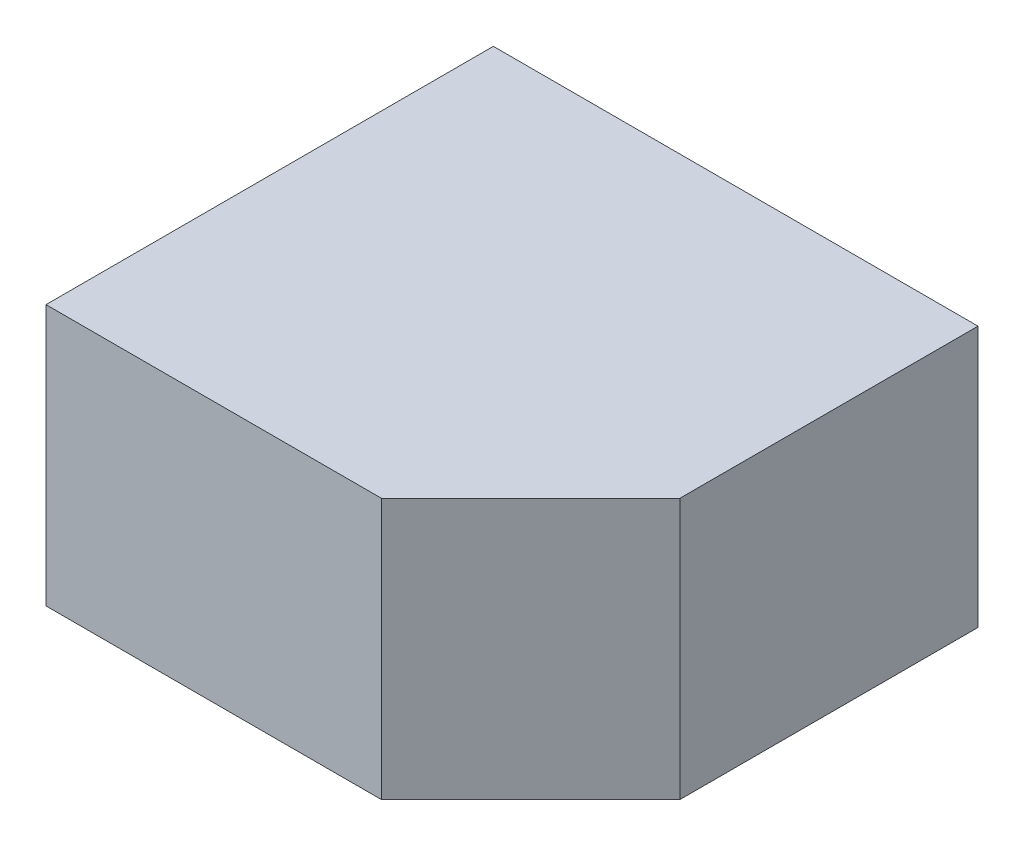
ISO-10303-21;
HEADER;
FILE_DESCRIPTION(('STEP AP214'),'2;1');
FILE_NAME('part.step','',(''),(''),'','','');
FILE_SCHEMA(('AUTOMOTIVE_DESIGN { 1 0 10303 214 1 1 1 1 }'));
ENDSEC;
DATA;
#1=APPLICATION_CONTEXT('core data for automotive mechanical design processes');
#2=APPLICATION_PROTOCOL_DEFINITION('international standard','automotive_design',2000,#1);
#3=PRODUCT_CONTEXT('',#1,'mechanical');
#4=PRODUCT('Part','Part','',(#3));
#5=PRODUCT_RELATED_PRODUCT_CATEGORY('part','',(#4));
#6=PRODUCT_DEFINITION_FORMATION('','',#4);
#7=PRODUCT_DEFINITION_CONTEXT('part definition',#1,'design');
#8=PRODUCT_DEFINITION('design','',#6,#7);
#9=PRODUCT_DEFINITION_SHAPE('','',#8);
#10=(LENGTH_UNIT() NAMED_UNIT(*) SI_UNIT(.MILLI.,.METRE.));
#11=(NAMED_UNIT(*) PLANE_ANGLE_UNIT() SI_UNIT($,.RADIAN.));
#12=(NAMED_UNIT(*) SI_UNIT($,.STERADIAN.) SOLID_ANGLE_UNIT());
#13=UNCERTAINTY_MEASURE_WITH_UNIT(LENGTH_MEASURE(1.E-05),#10,'distance_accuracy_value','');
#14=(GEOMETRIC_REPRESENTATION_CONTEXT(3) GLOBAL_UNCERTAINTY_ASSIGNED_CONTEXT((#13)) GLOBAL_UNIT_ASSIGNED_CONTEXT((#10,
#11,#12)) REPRESENTATION_CONTEXT('',''));
#15=CARTESIAN_POINT('',(0.,0.,0.));
#16=DIRECTION('',(0.,0.,1.));
#17=DIRECTION('',(1.,0.,0.));
#18=AXIS2_PLACEMENT_3D('',#15,#16,#17);
#19=CARTESIAN_POINT('',(-251.5,479.,600.));
#20=DIRECTION('',(-1.,0.,0.));
#21=DIRECTION('',(0.,0.,1.));
#22=AXIS2_PLACEMENT_3D('',#19,#20,#21);
#23=PLANE('',#22);
#24=DIRECTION('',(0.,1.,0.));
#25=VECTOR('',#24,1.);
#26=CARTESIAN_POINT('',(-251.5,479.,0.));
#27=LINE('',#26,#25);
#28=CARTESIAN_POINT('',(-251.5,479.,0.));
#29=VERTEX_POINT('',#28);
#30=CARTESIAN_POINT('',(-251.5,829.,0.));
#31=VERTEX_POINT('',#30);
#32=EDGE_CURVE('E107',#29,#31,#27,.T.);
#33=ORIENTED_EDGE('',*,*,#32,.F.);
#34=DIRECTION('',(0.,0.,-1.));
#35=VECTOR('',#34,1.);
#36=CARTESIAN_POINT('',(-251.5,479.,600.));
#37=LINE('',#36,#35);
#38=CARTESIAN_POINT('',(-251.5,479.,600.));
#39=VERTEX_POINT('',#38);
#40=EDGE_CURVE('E99',#39,#29,#37,.T.);
#41=ORIENTED_EDGE('',*,*,#40,.F.);
#42=DIRECTION('',(0.,1.,0.));
#43=VECTOR('',#42,1.);
#44=CARTESIAN_POINT('',(-251.5,479.,600.));
#45=LINE('',#44,#43);
#46=CARTESIAN_POINT('',(-251.5,829.,600.));
#47=VERTEX_POINT('',#46);
#48=EDGE_CURVE('E96',#39,#47,#45,.T.);
#49=ORIENTED_EDGE('',*,*,#48,.T.);
#50=DIRECTION('',(0.,0.,-1.));
#51=VECTOR('',#50,1.);
#52=CARTESIAN_POINT('',(-251.5,829.,600.));
#53=LINE('',#52,#51);
#54=EDGE_CURVE('E81',#47,#31,#53,.T.);
#55=ORIENTED_EDGE('',*,*,#54,.T.);
#56=EDGE_LOOP('',(#33,#41,#49,#55));
#57=FACE_BOUND('',#56,.T.);
#58=ADVANCED_FACE('F36',(#57),#23,.T.);
#59=CARTESIAN_POINT('',(-251.5,479.,600.));
#60=DIRECTION('',(0.,-1.,0.));
#61=DIRECTION('',(1.,0.,0.));
#62=AXIS2_PLACEMENT_3D('',#59,#60,#61);
#63=PLANE('',#62);
#64=DIRECTION('',(0.,0.,-1.));
#65=VECTOR('',#64,1.);
#66=CARTESIAN_POINT('',(398.5,479.,600.));
#67=LINE('',#66,#65);
#68=CARTESIAN_POINT('',(398.5,479.,400.));
#69=VERTEX_POINT('',#68);
#70=CARTESIAN_POINT('',(398.5,479.,0.));
#71=VERTEX_POINT('',#70);
#72=EDGE_CURVE('E114',#69,#71,#67,.T.);
#73=ORIENTED_EDGE('',*,*,#72,.F.);
#74=DIRECTION('',(-0.707106781186549,0.,0.707106781186546));
#75=VECTOR('',#74,1.);
#76=CARTESIAN_POINT('',(-26.5000000000012,479.,825.));
#77=LINE('',#76,#75);
#78=CARTESIAN_POINT('',(198.499999999999,479.,600.));
#79=VERTEX_POINT('',#78);
#80=EDGE_CURVE('E58',#69,#79,#77,.T.);
#81=ORIENTED_EDGE('',*,*,#80,.T.);
#82=DIRECTION('',(-1.,0.,0.));
#83=VECTOR('',#82,1.);
#84=CARTESIAN_POINT('',(-251.5,479.,600.));
#85=LINE('',#84,#83);
#86=EDGE_CURVE('E92',#79,#39,#85,.T.);
#87=ORIENTED_EDGE('',*,*,#86,.T.);
#88=ORIENTED_EDGE('',*,*,#40,.T.);
#89=DIRECTION('',(-1.,0.,0.));
#90=VECTOR('',#89,1.);
#91=CARTESIAN_POINT('',(-251.5,479.,0.));
#92=LINE('',#91,#90);
#93=EDGE_CURVE('E100',#71,#29,#92,.T.);
#94=ORIENTED_EDGE('',*,*,#93,.F.);
#95=EDGE_LOOP('',(#73,#81,#87,#88,#94));
#96=FACE_BOUND('',#95,.T.);
#97=ADVANCED_FACE('F126',(#96),#63,.T.);
#98=CARTESIAN_POINT('',(398.5,479.,600.));
#99=DIRECTION('',(1.,0.,0.));
#100=DIRECTION('',(0.,0.,-1.));
#101=AXIS2_PLACEMENT_3D('',#98,#99,#100);
#102=PLANE('',#101);
#103=DIRECTION('',(0.,0.,-1.));
#104=VECTOR('',#103,1.);
#105=CARTESIAN_POINT('',(398.5,829.,600.));
#106=LINE('',#105,#104);
#107=CARTESIAN_POINT('',(398.5,829.,400.));
#108=VERTEX_POINT('',#107);
#109=CARTESIAN_POINT('',(398.5,829.,0.));
#110=VERTEX_POINT('',#109);
#111=EDGE_CURVE('E91',#108,#110,#106,.T.);
#112=ORIENTED_EDGE('',*,*,#111,.F.);
#113=DIRECTION('',(0.,-1.,0.));
#114=VECTOR('',#113,1.);
#115=CARTESIAN_POINT('',(398.5,479.,400.));
#116=LINE('',#115,#114);
#117=EDGE_CURVE('E113',#108,#69,#116,.T.);
#118=ORIENTED_EDGE('',*,*,#117,.T.);
#119=ORIENTED_EDGE('',*,*,#72,.T.);
#120=DIRECTION('',(0.,-1.,0.));
#121=VECTOR('',#120,1.);
#122=CARTESIAN_POINT('',(398.5,479.,0.));
#123=LINE('',#122,#121);
#124=EDGE_CURVE('E103',#110,#71,#123,.T.);
#125=ORIENTED_EDGE('',*,*,#124,.F.);
#126=EDGE_LOOP('',(#112,#118,#119,#125));
#127=FACE_BOUND('',#126,.T.);
#128=ADVANCED_FACE('F122',(#127),#102,.T.);
#129=CARTESIAN_POINT('',(-251.5,829.,600.));
#130=DIRECTION('',(0.,1.,0.));
#131=DIRECTION('',(-1.,0.,0.));
#132=AXIS2_PLACEMENT_3D('',#129,#130,#131);
#133=PLANE('',#132);
#134=DIRECTION('',(1.,0.,0.));
#135=VECTOR('',#134,1.);
#136=CARTESIAN_POINT('',(-251.5,829.,600.));
#137=LINE('',#136,#135);
#138=CARTESIAN_POINT('',(198.499999999999,829.,600.));
#139=VERTEX_POINT('',#138);
#140=EDGE_CURVE('E83',#47,#139,#137,.T.);
#141=ORIENTED_EDGE('',*,*,#140,.T.);
#142=DIRECTION('',(0.707106781186549,0.,-0.707106781186546));
#143=VECTOR('',#142,1.);
#144=CARTESIAN_POINT('',(-26.5000000000012,829.,825.));
#145=LINE('',#144,#143);
#146=EDGE_CURVE('E11',#139,#108,#145,.T.);
#147=ORIENTED_EDGE('',*,*,#146,.T.);
#148=ORIENTED_EDGE('',*,*,#111,.T.);
#149=DIRECTION('',(1.,0.,0.));
#150=VECTOR('',#149,1.);
#151=CARTESIAN_POINT('',(-251.5,829.,0.));
#152=LINE('',#151,#150);
#153=EDGE_CURVE('E86',#31,#110,#152,.T.);
#154=ORIENTED_EDGE('',*,*,#153,.F.);
#155=ORIENTED_EDGE('',*,*,#54,.F.);
#156=EDGE_LOOP('',(#141,#147,#148,#154,#155));
#157=FACE_BOUND('',#156,.T.);
#158=ADVANCED_FACE('F82',(#157),#133,.T.);
#159=CARTESIAN_POINT('',(0.,0.,600.));
#160=DIRECTION('',(0.,0.,-1.));
#161=DIRECTION('',(-1.,0.,0.));
#162=AXIS2_PLACEMENT_3D('',#159,#160,#161);
#163=PLANE('',#162);
#164=ORIENTED_EDGE('',*,*,#86,.F.);
#165=DIRECTION('',(0.,1.,0.));
#166=VECTOR('',#165,1.);
#167=CARTESIAN_POINT('',(198.499999999999,829.,600.));
#168=LINE('',#167,#166);
#169=EDGE_CURVE('E44',#79,#139,#168,.T.);
#170=ORIENTED_EDGE('',*,*,#169,.T.);
#171=ORIENTED_EDGE('',*,*,#140,.F.);
#172=ORIENTED_EDGE('',*,*,#48,.F.);
#173=EDGE_LOOP('',(#164,#170,#171,#172));
#174=FACE_BOUND('',#173,.T.);
#175=ADVANCED_FACE('F95',(#174),#163,.F.);
#176=CARTESIAN_POINT('',(0.,0.,0.));
#177=DIRECTION('',(0.,0.,-1.));
#178=DIRECTION('',(-1.,0.,0.));
#179=AXIS2_PLACEMENT_3D('',#176,#177,#178);
#180=PLANE('',#179);
#181=ORIENTED_EDGE('',*,*,#32,.T.);
#182=ORIENTED_EDGE('',*,*,#153,.T.);
#183=ORIENTED_EDGE('',*,*,#124,.T.);
#184=ORIENTED_EDGE('',*,*,#93,.T.);
#185=EDGE_LOOP('',(#181,#182,#183,#184));
#186=FACE_BOUND('',#185,.T.);
#187=ADVANCED_FACE('F128',(#186),#180,.T.);
#188=CARTESIAN_POINT('',(398.5,479.,400.));
#189=DIRECTION('',(0.707106781186546,0.,0.707106781186549));
#190=DIRECTION('',(0.,1.,0.));
#191=AXIS2_PLACEMENT_3D('',#188,#189,#190);
#192=PLANE('',#191);
#193=ORIENTED_EDGE('',*,*,#146,.F.);
#194=ORIENTED_EDGE('',*,*,#169,.F.);
#195=ORIENTED_EDGE('',*,*,#80,.F.);
#196=ORIENTED_EDGE('',*,*,#117,.F.);
#197=EDGE_LOOP('',(#193,#194,#195,#196));
#198=FACE_BOUND('',#197,.T.);
#199=ADVANCED_FACE('F38',(#198),#192,.T.);
#200=CLOSED_SHELL('',(#58,#97,#128,#158,#175,#187,#199));
#201=MANIFOLD_SOLID_BREP('B2',#200);
#202=ADVANCED_BREP_SHAPE_REPRESENTATION('',(#18,#201),#14);
#203=SHAPE_DEFINITION_REPRESENTATION(#9,#202);
ENDSEC;
END-ISO-10303-21;
